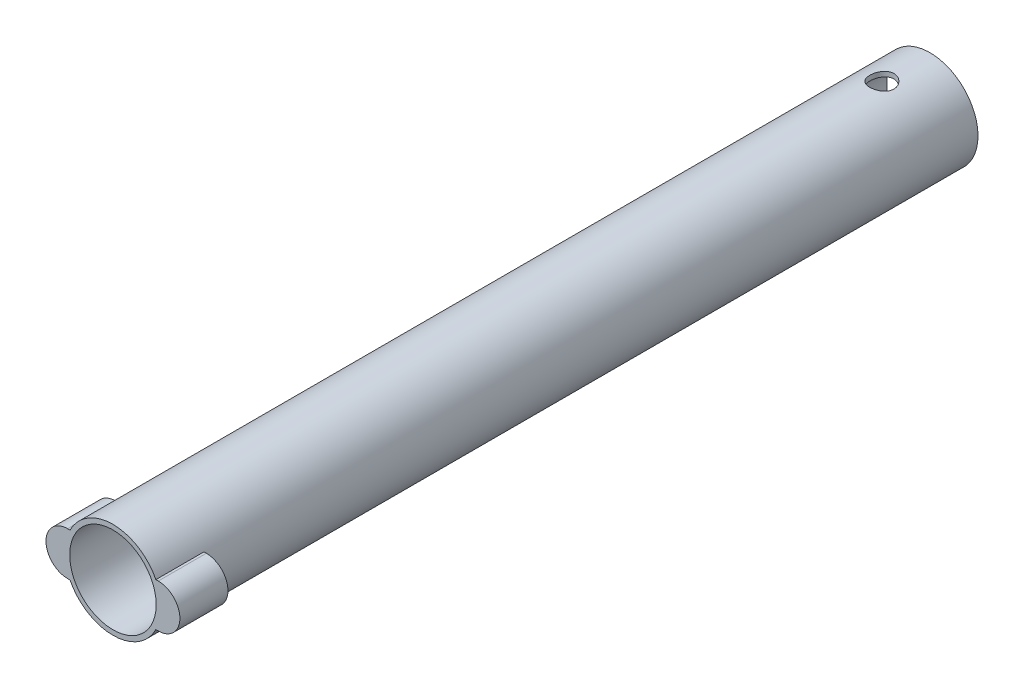
ISO-10303-21;
HEADER;
FILE_DESCRIPTION(('STEP AP214'),'2;1');
FILE_NAME('part.step','',(''),(''),'','','');
FILE_SCHEMA(('AUTOMOTIVE_DESIGN { 1 0 10303 214 1 1 1 1 }'));
ENDSEC;
DATA;
#1=APPLICATION_CONTEXT('core data for automotive mechanical design processes');
#2=APPLICATION_PROTOCOL_DEFINITION('international standard','automotive_design',2000,#1);
#3=PRODUCT_CONTEXT('',#1,'mechanical');
#4=PRODUCT('Part','Part','',(#3));
#5=PRODUCT_RELATED_PRODUCT_CATEGORY('part','',(#4));
#6=PRODUCT_DEFINITION_FORMATION('','',#4);
#7=PRODUCT_DEFINITION_CONTEXT('part definition',#1,'design');
#8=PRODUCT_DEFINITION('design','',#6,#7);
#9=PRODUCT_DEFINITION_SHAPE('','',#8);
#10=(LENGTH_UNIT() NAMED_UNIT(*) SI_UNIT(.MILLI.,.METRE.));
#11=(NAMED_UNIT(*) PLANE_ANGLE_UNIT() SI_UNIT($,.RADIAN.));
#12=(NAMED_UNIT(*) SI_UNIT($,.STERADIAN.) SOLID_ANGLE_UNIT());
#13=UNCERTAINTY_MEASURE_WITH_UNIT(LENGTH_MEASURE(1.E-05),#10,'distance_accuracy_value','');
#14=(GEOMETRIC_REPRESENTATION_CONTEXT(3) GLOBAL_UNCERTAINTY_ASSIGNED_CONTEXT((#13)) GLOBAL_UNIT_ASSIGNED_CONTEXT((#10,
#11,#12)) REPRESENTATION_CONTEXT('',''));
#15=CARTESIAN_POINT('',(0.,0.,0.));
#16=DIRECTION('',(0.,0.,1.));
#17=DIRECTION('',(1.,0.,0.));
#18=AXIS2_PLACEMENT_3D('',#15,#16,#17);
#19=CARTESIAN_POINT('',(0.,0.,170.));
#20=DIRECTION('',(0.,0.,1.));
#21=DIRECTION('',(1.,0.,0.));
#22=AXIS2_PLACEMENT_3D('',#19,#20,#21);
#23=PLANE('',#22);
#24=CARTESIAN_POINT('',(0.,0.,170.));
#25=DIRECTION('',(0.,0.,1.));
#26=DIRECTION('',(1.,0.,0.));
#27=AXIS2_PLACEMENT_3D('',#24,#25,#26);
#28=CIRCLE('',#27,10.);
#29=CARTESIAN_POINT('',(-8.93028554974588,-4.5,170.));
#30=VERTEX_POINT('',#29);
#31=CARTESIAN_POINT('',(8.93028554974583,-4.50000000000008,170.));
#32=VERTEX_POINT('',#31);
#33=EDGE_CURVE('E11',#30,#32,#28,.T.);
#34=ORIENTED_EDGE('',*,*,#33,.T.);
#35=DIRECTION('',(1.,0.,0.));
#36=VECTOR('',#35,1.);
#37=CARTESIAN_POINT('',(8.93028554974583,-4.50000000000008,170.));
#38=LINE('',#37,#36);
#39=CARTESIAN_POINT('',(9.43028554974587,-4.50000000000008,170.));
#40=VERTEX_POINT('',#39);
#41=EDGE_CURVE('E138',#32,#40,#38,.T.);
#42=ORIENTED_EDGE('',*,*,#41,.T.);
#43=CARTESIAN_POINT('',(9.4302855497459,0.,170.));
#44=DIRECTION('',(0.,0.,1.));
#45=DIRECTION('',(-1.,0.,0.));
#46=AXIS2_PLACEMENT_3D('',#43,#44,#45);
#47=CIRCLE('',#46,4.5);
#48=CARTESIAN_POINT('',(9.43028554974592,4.49999999999992,170.));
#49=VERTEX_POINT('',#48);
#50=EDGE_CURVE('E154',#40,#49,#47,.T.);
#51=ORIENTED_EDGE('',*,*,#50,.T.);
#52=DIRECTION('',(-1.,0.,0.));
#53=VECTOR('',#52,1.);
#54=CARTESIAN_POINT('',(8.93028554974592,4.49999999999992,170.));
#55=LINE('',#54,#53);
#56=CARTESIAN_POINT('',(8.93028554974592,4.49999999999992,170.));
#57=VERTEX_POINT('',#56);
#58=EDGE_CURVE('E63',#49,#57,#55,.T.);
#59=ORIENTED_EDGE('',*,*,#58,.T.);
#60=CARTESIAN_POINT('',(-8.93028554974588,4.5,170.));
#61=VERTEX_POINT('',#60);
#62=EDGE_CURVE('E55',#57,#61,#28,.T.);
#63=ORIENTED_EDGE('',*,*,#62,.T.);
#64=DIRECTION('',(-1.,0.,0.));
#65=VECTOR('',#64,1.);
#66=CARTESIAN_POINT('',(-9.43028554974588,4.5,170.));
#67=LINE('',#66,#65);
#68=CARTESIAN_POINT('',(-9.43028554974588,4.5,170.));
#69=VERTEX_POINT('',#68);
#70=EDGE_CURVE('E173',#61,#69,#67,.T.);
#71=ORIENTED_EDGE('',*,*,#70,.T.);
#72=CARTESIAN_POINT('',(-9.4302855497459,0.,170.));
#73=DIRECTION('',(0.,0.,1.));
#74=DIRECTION('',(1.,0.,0.));
#75=AXIS2_PLACEMENT_3D('',#72,#73,#74);
#76=CIRCLE('',#75,4.5);
#77=CARTESIAN_POINT('',(-9.43028554974588,-4.5,170.));
#78=VERTEX_POINT('',#77);
#79=EDGE_CURVE('E161',#69,#78,#76,.T.);
#80=ORIENTED_EDGE('',*,*,#79,.T.);
#81=DIRECTION('',(1.,0.,0.));
#82=VECTOR('',#81,1.);
#83=CARTESIAN_POINT('',(-9.43028554974588,-4.5,170.));
#84=LINE('',#83,#82);
#85=EDGE_CURVE('E69',#78,#30,#84,.T.);
#86=ORIENTED_EDGE('',*,*,#85,.T.);
#87=EDGE_LOOP('',(#34,#42,#51,#59,#63,#71,#80,#86));
#88=FACE_BOUND('',#87,.T.);
#89=CARTESIAN_POINT('',(0.,0.,170.));
#90=DIRECTION('',(0.,0.,1.));
#91=DIRECTION('',(1.,0.,0.));
#92=AXIS2_PLACEMENT_3D('',#89,#90,#91);
#93=CIRCLE('',#92,9.);
#94=CARTESIAN_POINT('',(9.,0.,170.));
#95=VERTEX_POINT('',#94);
#96=EDGE_CURVE('E206',#95,#95,#93,.T.);
#97=ORIENTED_EDGE('',*,*,#96,.F.);
#98=EDGE_LOOP('',(#97));
#99=FACE_BOUND('',#98,.T.);
#100=ADVANCED_FACE('F39',(#88,#99),#23,.T.);
#101=CARTESIAN_POINT('',(0.,0.,0.));
#102=DIRECTION('',(0.,0.,1.));
#103=DIRECTION('',(1.,0.,0.));
#104=AXIS2_PLACEMENT_3D('',#101,#102,#103);
#105=PLANE('',#104);
#106=CARTESIAN_POINT('',(0.,0.,0.));
#107=DIRECTION('',(0.,0.,1.));
#108=DIRECTION('',(1.,0.,0.));
#109=AXIS2_PLACEMENT_3D('',#106,#107,#108);
#110=CIRCLE('',#109,10.);
#111=CARTESIAN_POINT('',(10.,0.,0.));
#112=VERTEX_POINT('',#111);
#113=EDGE_CURVE('E210',#112,#112,#110,.T.);
#114=ORIENTED_EDGE('',*,*,#113,.F.);
#115=EDGE_LOOP('',(#114));
#116=FACE_BOUND('',#115,.T.);
#117=CARTESIAN_POINT('',(0.,0.,0.));
#118=DIRECTION('',(0.,0.,1.));
#119=DIRECTION('',(1.,0.,0.));
#120=AXIS2_PLACEMENT_3D('',#117,#118,#119);
#121=CIRCLE('',#120,9.);
#122=CARTESIAN_POINT('',(9.,0.,0.));
#123=VERTEX_POINT('',#122);
#124=EDGE_CURVE('E196',#123,#123,#121,.T.);
#125=ORIENTED_EDGE('',*,*,#124,.T.);
#126=EDGE_LOOP('',(#125));
#127=FACE_BOUND('',#126,.T.);
#128=ADVANCED_FACE('F260',(#116,#127),#105,.F.);
#129=CARTESIAN_POINT('',(0.,0.,170.));
#130=DIRECTION('',(0.,0.,-1.));
#131=DIRECTION('',(-1.,0.,0.));
#132=AXIS2_PLACEMENT_3D('',#129,#130,#131);
#133=CYLINDRICAL_SURFACE('',#132,10.);
#134=CARTESIAN_POINT('',(0.,-10.,12.5));
#135=CARTESIAN_POINT('',(0.138126814449552,-9.99999766446687,12.4999961237697));
#136=CARTESIAN_POINT('',(0.276296929717939,-9.99710963553044,12.4885140820437));
#137=CARTESIAN_POINT('',(0.548677206284221,-9.98586856383157,12.442958081155));
#138=CARTESIAN_POINT('',(0.6828850781179,-9.97751242366627,12.4088713174369));
#139=CARTESIAN_POINT('',(0.943368120304295,-9.9562604388672,12.3192679108965));
#140=CARTESIAN_POINT('',(1.06965260571667,-9.94337004736764,12.2637770021412));
#141=CARTESIAN_POINT('',(1.31112021984071,-9.91442239679369,12.1330310165919));
#142=CARTESIAN_POINT('',(1.42630297391461,-9.89836503090261,12.0577752731351));
#143=CARTESIAN_POINT('',(1.64466987883486,-9.86445689319489,11.8879986839097));
#144=CARTESIAN_POINT('',(1.74759281676843,-9.84657845246877,11.7931473750682));
#145=CARTESIAN_POINT('',(1.93624821200553,-9.8112270019656,11.5875796584849));
#146=CARTESIAN_POINT('',(2.02197872824865,-9.79375403816446,11.4768614617551));
#147=CARTESIAN_POINT('',(2.17504423799829,-9.76091292830281,11.240674622105));
#148=CARTESIAN_POINT('',(2.2420870265419,-9.74557990774685,11.1150112819855));
#149=CARTESIAN_POINT('',(2.35399484758457,-9.71915824696694,10.8537526472333));
#150=CARTESIAN_POINT('',(2.39886342573357,-9.70806892824031,10.7181589444466));
#151=CARTESIAN_POINT('',(2.46425806134128,-9.69167461160538,10.4437608363306));
#152=CARTESIAN_POINT('',(2.48525378055342,-9.68625818328352,10.30507517327));
#153=CARTESIAN_POINT('',(2.50376962511068,-9.68148937432652,10.0260523850011));
#154=CARTESIAN_POINT('',(2.50129356969685,-9.68213600713214,9.88571553217977));
#155=CARTESIAN_POINT('',(2.47331087439951,-9.68932009194695,9.61097365375774));
#156=CARTESIAN_POINT('',(2.44836390031772,-9.69571438345489,9.47650729755778));
#157=CARTESIAN_POINT('',(2.37704031150499,-9.71344516118448,9.2137315818149));
#158=CARTESIAN_POINT('',(2.33066217011566,-9.72478199948731,9.08542266161846));
#159=CARTESIAN_POINT('',(2.21731579656198,-9.75125189842765,8.83710330624645));
#160=CARTESIAN_POINT('',(2.1501444453882,-9.76642212449693,8.71718971368405));
#161=CARTESIAN_POINT('',(1.99726046002491,-9.79882851409985,8.49013548373863));
#162=CARTESIAN_POINT('',(1.91154458134806,-9.81606503891047,8.38299708655458));
#163=CARTESIAN_POINT('',(1.72110570780203,-9.85126467566485,8.18132730717599));
#164=CARTESIAN_POINT('',(1.61591043027643,-9.86923449130001,8.08724251656441));
#165=CARTESIAN_POINT('',(1.39101986250616,-9.90343275964594,7.91796459589349));
#166=CARTESIAN_POINT('',(1.27132412951324,-9.91966115915679,7.84277204289406));
#167=CARTESIAN_POINT('',(1.02019314780232,-9.94862886823651,7.71324902295935));
#168=CARTESIAN_POINT('',(0.888718988681039,-9.96135600212879,7.65899109957595));
#169=CARTESIAN_POINT('',(0.618126680238138,-9.98179861652361,7.57347115715071));
#170=CARTESIAN_POINT('',(0.479009998584141,-9.98951505565468,7.5422047393031));
#171=CARTESIAN_POINT('',(0.200899950650044,-9.99892498785624,7.50423739073527));
#172=CARTESIAN_POINT('',(0.0619945333136826,-10.0007675584713,7.49692828987449));
#173=CARTESIAN_POINT('',(-0.215054791335848,-9.99864674690754,7.50541500342581));
#174=CARTESIAN_POINT('',(-0.353198766074328,-9.99468388736421,7.52120873799856));
#175=CARTESIAN_POINT('',(-0.622690447960818,-9.98149301878918,7.57495151398563));
#176=CARTESIAN_POINT('',(-0.754108531614583,-9.97234390309647,7.61256877246162));
#177=CARTESIAN_POINT('',(-1.00876215408753,-9.94981177723595,7.7085118067141));
#178=CARTESIAN_POINT('',(-1.13199686505442,-9.93642833949965,7.76683967385537));
#179=CARTESIAN_POINT('',(-1.36920522404972,-9.9065551321037,7.90372688145779));
#180=CARTESIAN_POINT('',(-1.48297573639294,-9.89001445610999,7.98262685399427));
#181=CARTESIAN_POINT('',(-1.69587768940552,-9.85574181979586,8.15798318132861));
#182=CARTESIAN_POINT('',(-1.79500659828875,-9.83800965421578,8.25444256602941));
#183=CARTESIAN_POINT('',(-1.97831761345414,-9.80281594932498,8.46500326807284));
#184=CARTESIAN_POINT('',(-2.06207311270184,-9.78537173637463,8.57947950499927));
#185=CARTESIAN_POINT('',(-2.20918459835605,-9.75321463970069,8.82122105744763));
#186=CARTESIAN_POINT('',(-2.27254149026901,-9.73850163474941,8.94848580495074));
#187=CARTESIAN_POINT('',(-2.37658570101224,-9.71363491194665,9.21150953734373));
#188=CARTESIAN_POINT('',(-2.41740732773931,-9.70345425375809,9.34721271385383));
#189=CARTESIAN_POINT('',(-2.47557609990489,-9.68877906706585,9.62384939642549));
#190=CARTESIAN_POINT('',(-2.49292837912652,-9.68428329504044,9.76478175170242));
#191=CARTESIAN_POINT('',(-2.50339765056083,-9.68158168701612,10.0435350397693));
#192=CARTESIAN_POINT('',(-2.49719649630132,-9.68319887888035,10.1813290585441));
#193=CARTESIAN_POINT('',(-2.46229546385366,-9.69213181672143,10.4538398144438));
#194=CARTESIAN_POINT('',(-2.43359603781098,-9.69944744817731,10.5885566133553));
#195=CARTESIAN_POINT('',(-2.35488553240495,-9.71885434473222,10.8503474317764));
#196=CARTESIAN_POINT('',(-2.30500234113404,-9.73091692061057,10.9774621754006));
#197=CARTESIAN_POINT('',(-2.18544152267504,-9.7584625954084,11.2216089711893));
#198=CARTESIAN_POINT('',(-2.11576115005696,-9.77394616867808,11.3386396219781));
#199=CARTESIAN_POINT('',(-1.95644624772858,-9.80709390439337,11.5625910483368));
#200=CARTESIAN_POINT('',(-1.86633860485376,-9.82480441386302,11.6691684557066));
#201=CARTESIAN_POINT('',(-1.66964895198289,-9.86013378743769,11.8659117413257));
#202=CARTESIAN_POINT('',(-1.56306303543524,-9.87775262878422,11.9560737168549));
#203=CARTESIAN_POINT('',(-1.33411264450432,-9.9112942607945,12.1190188476077));
#204=CARTESIAN_POINT('',(-1.21149737052731,-9.92718055609783,12.1914576894526));
#205=CARTESIAN_POINT('',(-0.95544343251746,-9.95508208291861,12.3145791049009));
#206=CARTESIAN_POINT('',(-0.822012605727899,-9.96710008666301,12.3652772677476));
#207=CARTESIAN_POINT('',(-0.574017088739119,-9.98413432609236,12.4359530505494));
#208=CARTESIAN_POINT('',(-0.460633618180114,-9.99004308421151,12.4599187384224));
#209=CARTESIAN_POINT('',(-0.231510119227139,-9.9979767538658,12.4919432393699));
#210=CARTESIAN_POINT('',(-0.115770268737694,-10.0000019575149,12.5000032488422));
#211=CARTESIAN_POINT('',(0.,-10.,12.5));
#212=B_SPLINE_CURVE_WITH_KNOTS('',3,(#134,#135,#136,#137,#138,#139,#140,#141,#142,#143,#144,
#145,#146,#147,#148,#149,#150,#151,#152,#153,#154,#155,#156,#157,#158,#159,#160,#161,#162,#163,
#164,#165,#166,#167,#168,#169,#170,#171,#172,#173,#174,#175,#176,#177,#178,#179,#180,#181,#182,
#183,#184,#185,#186,#187,#188,#189,#190,#191,#192,#193,#194,#195,#196,#197,#198,#199,#200,#201,
#202,#203,#204,#205,#206,#207,#208,#209,#210,#211),.UNSPECIFIED.,.T.,.F.,(4,2,2,2,2,2,2,2,2,2,2,
2,2,2,2,2,2,2,2,2,2,2,2,2,2,2,2,2,2,2,2,2,2,2,2,2,2,2,4),(0.,0.41395618745315,0.828147062939833,
1.24184150381018,1.65554990028221,2.07690725728565,2.4983121596677,2.92597745909678,
3.35357435282281,3.77260491835116,4.19156730193363,4.60037495017231,5.00921172448932,
5.42217546462,5.83521151399139,6.26002501620567,6.6848514926928,7.11113715020725,
7.5373412281994,7.95263848254329,8.36789835193439,8.7770045752893,9.18615212209352,
9.60255979281122,10.0190393835223,10.44574182013,10.8724253125472,11.2965375769764,
11.7205570543048,12.1323963400749,12.5442273493652,12.9536066760888,13.3630428023797,
13.7831596069298,14.2033761629383,14.6312030917578,15.0587227304538,15.4057040491338,
15.752659267482),.UNSPECIFIED.);
#213=CARTESIAN_POINT('',(0.,-10.,12.5));
#214=VERTEX_POINT('',#213);
#215=EDGE_CURVE('E144',#214,#214,#212,.T.);
#216=ORIENTED_EDGE('',*,*,#215,.T.);
#217=EDGE_LOOP('',(#216));
#218=FACE_BOUND('',#217,.T.);
#219=CARTESIAN_POINT('',(0.,10.,12.5));
#220=CARTESIAN_POINT('',(-0.138126814449552,9.99999766446687,12.4999961237697));
#221=CARTESIAN_POINT('',(-0.276296929717939,9.99710963553044,12.4885140820437));
#222=CARTESIAN_POINT('',(-0.548677206284221,9.98586856383157,12.442958081155));
#223=CARTESIAN_POINT('',(-0.6828850781179,9.97751242366627,12.4088713174369));
#224=CARTESIAN_POINT('',(-0.943368120304295,9.9562604388672,12.3192679108965));
#225=CARTESIAN_POINT('',(-1.06965260571667,9.94337004736764,12.2637770021412));
#226=CARTESIAN_POINT('',(-1.31112021984071,9.91442239679369,12.1330310165919));
#227=CARTESIAN_POINT('',(-1.42630297391461,9.89836503090261,12.0577752731351));
#228=CARTESIAN_POINT('',(-1.64466987883486,9.86445689319489,11.8879986839097));
#229=CARTESIAN_POINT('',(-1.74759281676843,9.84657845246877,11.7931473750682));
#230=CARTESIAN_POINT('',(-1.93624821200553,9.8112270019656,11.5875796584849));
#231=CARTESIAN_POINT('',(-2.02197872824865,9.79375403816446,11.4768614617551));
#232=CARTESIAN_POINT('',(-2.17504423799829,9.76091292830281,11.240674622105));
#233=CARTESIAN_POINT('',(-2.2420870265419,9.74557990774685,11.1150112819855));
#234=CARTESIAN_POINT('',(-2.35399484758457,9.71915824696694,10.8537526472333));
#235=CARTESIAN_POINT('',(-2.39886342573357,9.70806892824031,10.7181589444466));
#236=CARTESIAN_POINT('',(-2.46425806134128,9.69167461160538,10.4437608363306));
#237=CARTESIAN_POINT('',(-2.48525378055342,9.68625818328352,10.30507517327));
#238=CARTESIAN_POINT('',(-2.50376962511068,9.68148937432652,10.0260523850011));
#239=CARTESIAN_POINT('',(-2.50129356969685,9.68213600713214,9.88571553217977));
#240=CARTESIAN_POINT('',(-2.47331087439951,9.68932009194695,9.61097365375774));
#241=CARTESIAN_POINT('',(-2.44836390031772,9.69571438345489,9.47650729755778));
#242=CARTESIAN_POINT('',(-2.37704031150499,9.71344516118448,9.2137315818149));
#243=CARTESIAN_POINT('',(-2.33066217011566,9.72478199948731,9.08542266161846));
#244=CARTESIAN_POINT('',(-2.21731579656198,9.75125189842765,8.83710330624645));
#245=CARTESIAN_POINT('',(-2.1501444453882,9.76642212449693,8.71718971368405));
#246=CARTESIAN_POINT('',(-1.99726046002491,9.79882851409985,8.49013548373863));
#247=CARTESIAN_POINT('',(-1.91154458134806,9.81606503891047,8.38299708655458));
#248=CARTESIAN_POINT('',(-1.72110570780203,9.85126467566485,8.18132730717599));
#249=CARTESIAN_POINT('',(-1.61591043027643,9.86923449130001,8.08724251656441));
#250=CARTESIAN_POINT('',(-1.39101986250616,9.90343275964594,7.91796459589349));
#251=CARTESIAN_POINT('',(-1.27132412951324,9.91966115915679,7.84277204289406));
#252=CARTESIAN_POINT('',(-1.02019314780232,9.94862886823651,7.71324902295935));
#253=CARTESIAN_POINT('',(-0.888718988681039,9.96135600212879,7.65899109957595));
#254=CARTESIAN_POINT('',(-0.618126680238138,9.98179861652361,7.57347115715071));
#255=CARTESIAN_POINT('',(-0.479009998584141,9.98951505565468,7.5422047393031));
#256=CARTESIAN_POINT('',(-0.200899950650044,9.99892498785624,7.50423739073527));
#257=CARTESIAN_POINT('',(-0.0619945333136826,10.0007675584713,7.49692828987449));
#258=CARTESIAN_POINT('',(0.215054791335848,9.99864674690754,7.50541500342581));
#259=CARTESIAN_POINT('',(0.353198766074328,9.99468388736421,7.52120873799856));
#260=CARTESIAN_POINT('',(0.622690447960818,9.98149301878918,7.57495151398563));
#261=CARTESIAN_POINT('',(0.754108531614583,9.97234390309647,7.61256877246162));
#262=CARTESIAN_POINT('',(1.00876215408753,9.94981177723595,7.7085118067141));
#263=CARTESIAN_POINT('',(1.13199686505442,9.93642833949965,7.76683967385537));
#264=CARTESIAN_POINT('',(1.36920522404972,9.9065551321037,7.90372688145779));
#265=CARTESIAN_POINT('',(1.48297573639294,9.89001445610999,7.98262685399427));
#266=CARTESIAN_POINT('',(1.69587768940552,9.85574181979586,8.15798318132861));
#267=CARTESIAN_POINT('',(1.79500659828875,9.83800965421578,8.25444256602941));
#268=CARTESIAN_POINT('',(1.97831761345414,9.80281594932498,8.46500326807284));
#269=CARTESIAN_POINT('',(2.06207311270184,9.78537173637463,8.57947950499927));
#270=CARTESIAN_POINT('',(2.20918459835605,9.75321463970069,8.82122105744763));
#271=CARTESIAN_POINT('',(2.27254149026901,9.73850163474941,8.94848580495074));
#272=CARTESIAN_POINT('',(2.37658570101224,9.71363491194665,9.21150953734373));
#273=CARTESIAN_POINT('',(2.41740732773931,9.70345425375809,9.34721271385383));
#274=CARTESIAN_POINT('',(2.47557609990489,9.68877906706585,9.62384939642549));
#275=CARTESIAN_POINT('',(2.49292837912652,9.68428329504044,9.76478175170242));
#276=CARTESIAN_POINT('',(2.50339765056083,9.68158168701612,10.0435350397693));
#277=CARTESIAN_POINT('',(2.49719649630132,9.68319887888035,10.1813290585441));
#278=CARTESIAN_POINT('',(2.46229546385366,9.69213181672143,10.4538398144438));
#279=CARTESIAN_POINT('',(2.43359603781098,9.69944744817731,10.5885566133553));
#280=CARTESIAN_POINT('',(2.35488553240495,9.71885434473222,10.8503474317764));
#281=CARTESIAN_POINT('',(2.30500234113404,9.73091692061057,10.9774621754006));
#282=CARTESIAN_POINT('',(2.18544152267504,9.7584625954084,11.2216089711893));
#283=CARTESIAN_POINT('',(2.11576115005696,9.77394616867808,11.3386396219781));
#284=CARTESIAN_POINT('',(1.95644624772858,9.80709390439337,11.5625910483368));
#285=CARTESIAN_POINT('',(1.86633860485376,9.82480441386302,11.6691684557066));
#286=CARTESIAN_POINT('',(1.66964895198289,9.86013378743769,11.8659117413257));
#287=CARTESIAN_POINT('',(1.56306303543524,9.87775262878422,11.9560737168549));
#288=CARTESIAN_POINT('',(1.33411264450432,9.9112942607945,12.1190188476077));
#289=CARTESIAN_POINT('',(1.21149737052731,9.92718055609783,12.1914576894526));
#290=CARTESIAN_POINT('',(0.95544343251746,9.95508208291861,12.3145791049009));
#291=CARTESIAN_POINT('',(0.822012605727899,9.96710008666301,12.3652772677476));
#292=CARTESIAN_POINT('',(0.574017088739119,9.98413432609236,12.4359530505494));
#293=CARTESIAN_POINT('',(0.460633618180114,9.99004308421151,12.4599187384224));
#294=CARTESIAN_POINT('',(0.231510119227139,9.9979767538658,12.4919432393699));
#295=CARTESIAN_POINT('',(0.115770268737694,10.0000019575149,12.5000032488422));
#296=CARTESIAN_POINT('',(0.,10.,12.5));
#297=B_SPLINE_CURVE_WITH_KNOTS('',3,(#219,#220,#221,#222,#223,#224,#225,#226,#227,#228,#229,
#230,#231,#232,#233,#234,#235,#236,#237,#238,#239,#240,#241,#242,#243,#244,#245,#246,#247,#248,
#249,#250,#251,#252,#253,#254,#255,#256,#257,#258,#259,#260,#261,#262,#263,#264,#265,#266,#267,
#268,#269,#270,#271,#272,#273,#274,#275,#276,#277,#278,#279,#280,#281,#282,#283,#284,#285,#286,
#287,#288,#289,#290,#291,#292,#293,#294,#295,#296),.UNSPECIFIED.,.T.,.F.,(4,2,2,2,2,2,2,2,2,2,2,
2,2,2,2,2,2,2,2,2,2,2,2,2,2,2,2,2,2,2,2,2,2,2,2,2,2,2,4),(0.,0.41395618745315,0.828147062939833,
1.24184150381018,1.65554990028221,2.07690725728565,2.4983121596677,2.92597745909678,
3.35357435282281,3.77260491835116,4.19156730193363,4.60037495017231,5.00921172448932,
5.42217546462,5.83521151399139,6.26002501620567,6.6848514926928,7.11113715020725,
7.5373412281994,7.95263848254329,8.36789835193439,8.7770045752893,9.18615212209352,
9.60255979281122,10.0190393835223,10.44574182013,10.8724253125472,11.2965375769764,
11.7205570543048,12.1323963400749,12.5442273493652,12.9536066760888,13.3630428023797,
13.7831596069298,14.2033761629383,14.6312030917578,15.0587227304538,15.4057040491338,
15.752659267482),.UNSPECIFIED.);
#298=CARTESIAN_POINT('',(0.,10.,12.5));
#299=VERTEX_POINT('',#298);
#300=EDGE_CURVE('E236',#299,#299,#297,.T.);
#301=ORIENTED_EDGE('',*,*,#300,.T.);
#302=EDGE_LOOP('',(#301));
#303=FACE_BOUND('',#302,.T.);
#304=CARTESIAN_POINT('',(0.,0.,160.));
#305=DIRECTION('',(0.,0.,-1.));
#306=DIRECTION('',(1.,0.,0.));
#307=AXIS2_PLACEMENT_3D('',#304,#305,#306);
#308=CIRCLE('',#307,10.);
#309=CARTESIAN_POINT('',(8.93028554974592,4.49999999999992,160.));
#310=VERTEX_POINT('',#309);
#311=CARTESIAN_POINT('',(8.93028554974583,-4.50000000000008,160.));
#312=VERTEX_POINT('',#311);
#313=EDGE_CURVE('E132',#310,#312,#308,.T.);
#314=ORIENTED_EDGE('',*,*,#313,.T.);
#315=DIRECTION('',(0.,0.,1.));
#316=VECTOR('',#315,1.);
#317=CARTESIAN_POINT('',(8.93028554974583,-4.50000000000008,160.));
#318=LINE('',#317,#316);
#319=EDGE_CURVE('E162',#312,#32,#318,.T.);
#320=ORIENTED_EDGE('',*,*,#319,.T.);
#321=ORIENTED_EDGE('',*,*,#33,.F.);
#322=DIRECTION('',(0.,0.,1.));
#323=VECTOR('',#322,1.);
#324=CARTESIAN_POINT('',(-8.93028554974588,-4.5,160.));
#325=LINE('',#324,#323);
#326=CARTESIAN_POINT('',(-8.93028554974588,-4.5,160.));
#327=VERTEX_POINT('',#326);
#328=EDGE_CURVE('E201',#327,#30,#325,.T.);
#329=ORIENTED_EDGE('',*,*,#328,.F.);
#330=CARTESIAN_POINT('',(0.,0.,160.));
#331=DIRECTION('',(0.,0.,-1.));
#332=DIRECTION('',(1.,0.,0.));
#333=AXIS2_PLACEMENT_3D('',#330,#331,#332);
#334=CIRCLE('',#333,10.);
#335=CARTESIAN_POINT('',(-8.93028554974588,4.5,160.));
#336=VERTEX_POINT('',#335);
#337=EDGE_CURVE('E177',#327,#336,#334,.T.);
#338=ORIENTED_EDGE('',*,*,#337,.T.);
#339=DIRECTION('',(0.,0.,1.));
#340=VECTOR('',#339,1.);
#341=CARTESIAN_POINT('',(-8.93028554974588,4.5,160.));
#342=LINE('',#341,#340);
#343=EDGE_CURVE('E197',#336,#61,#342,.T.);
#344=ORIENTED_EDGE('',*,*,#343,.T.);
#345=ORIENTED_EDGE('',*,*,#62,.F.);
#346=DIRECTION('',(0.,0.,1.));
#347=VECTOR('',#346,1.);
#348=CARTESIAN_POINT('',(8.93028554974592,4.49999999999992,160.));
#349=LINE('',#348,#347);
#350=EDGE_CURVE('E122',#310,#57,#349,.T.);
#351=ORIENTED_EDGE('',*,*,#350,.F.);
#352=EDGE_LOOP('',(#314,#320,#321,#329,#338,#344,#345,#351));
#353=FACE_BOUND('',#352,.T.);
#354=ORIENTED_EDGE('',*,*,#113,.T.);
#355=EDGE_LOOP('',(#354));
#356=FACE_BOUND('',#355,.T.);
#357=ADVANCED_FACE('F41',(#218,#303,#353,#356),#133,.T.);
#358=CARTESIAN_POINT('',(0.,0.,170.));
#359=DIRECTION('',(0.,0.,-1.));
#360=DIRECTION('',(-1.,0.,0.));
#361=AXIS2_PLACEMENT_3D('',#358,#359,#360);
#362=CYLINDRICAL_SURFACE('',#361,9.);
#363=CARTESIAN_POINT('',(0.,-9.,12.5));
#364=CARTESIAN_POINT('',(0.137602501766358,-8.99999816033858,12.4999972008295));
#365=CARTESIAN_POINT('',(0.275234247505334,-8.99681348173661,12.4886013603894));
#366=CARTESIAN_POINT('',(0.546518951988477,-8.98441900396477,12.4434085434694));
#367=CARTESIAN_POINT('',(0.680170207326879,-8.97520666298524,12.4096021165726));
#368=CARTESIAN_POINT('',(0.939539899360603,-8.95177130789171,12.3207825611722));
#369=CARTESIAN_POINT('',(1.06526878019134,-8.9375550606186,12.2657980626032));
#370=CARTESIAN_POINT('',(1.30572139048355,-8.90560625164058,12.1362929873462));
#371=CARTESIAN_POINT('',(1.42044414162461,-8.88787337777625,12.0617706761614));
#372=CARTESIAN_POINT('',(1.63849356943184,-8.85030315634725,11.8933411323144));
#373=CARTESIAN_POINT('',(1.74150622561691,-8.8304274724643,11.7990359206252));
#374=CARTESIAN_POINT('',(1.93047637139272,-8.79105214235473,11.5945674457565));
#375=CARTESIAN_POINT('',(2.01643146169124,-8.77155254937625,11.4844019554483));
#376=CARTESIAN_POINT('',(2.17041617160631,-8.73474088585436,11.2487854797426));
#377=CARTESIAN_POINT('',(2.23807749895613,-8.71747695878199,11.1230855831171));
#378=CARTESIAN_POINT('',(2.35117914262341,-8.68765801630374,10.8615361647152));
#379=CARTESIAN_POINT('',(2.39662394672714,-8.67510204999899,10.7256886991666));
#380=CARTESIAN_POINT('',(2.46289848736025,-8.65651766235508,10.4511944222944));
#381=CARTESIAN_POINT('',(2.48430073808207,-8.65033771821211,10.3126963567531));
#382=CARTESIAN_POINT('',(2.50366854155516,-8.644752985852,10.0339482289146));
#383=CARTESIAN_POINT('',(2.50163888054626,-8.64534681401298,9.89369853025512));
#384=CARTESIAN_POINT('',(2.4746534267536,-8.65310733650123,9.61995544255189));
#385=CARTESIAN_POINT('',(2.45039804541374,-8.66007321349828,9.48638639700685));
#386=CARTESIAN_POINT('',(2.38077462403778,-8.67947034094293,9.22529274281753));
#387=CARTESIAN_POINT('',(2.33540476914307,-8.6919020611927,9.09776865479569));
#388=CARTESIAN_POINT('',(2.22428746268939,-8.72100139554956,8.85059553708924));
#389=CARTESIAN_POINT('',(2.15830043673985,-8.7377183720132,8.73106026637984));
#390=CARTESIAN_POINT('',(2.00798881359269,-8.77347901367673,8.50451684881757));
#391=CARTESIAN_POINT('',(1.9236603325812,-8.79252317128379,8.39751136254774));
#392=CARTESIAN_POINT('',(1.73551122056889,-8.83162144253916,8.19507223912715));
#393=CARTESIAN_POINT('',(1.63110455940472,-8.85168740075652,8.10018473024029));
#394=CARTESIAN_POINT('',(1.40761321440207,-8.88996399621587,7.92914853844438));
#395=CARTESIAN_POINT('',(1.28852785084393,-8.90817454746904,7.85300072379504));
#396=CARTESIAN_POINT('',(1.03816685867623,-8.94081679425529,7.72133636873985));
#397=CARTESIAN_POINT('',(0.906832791495496,-8.95522897291068,7.66592579212219));
#398=CARTESIAN_POINT('',(0.63621997753943,-8.97850985002887,7.57813180311726));
#399=CARTESIAN_POINT('',(0.49694312824226,-8.98737986647399,7.54574291568686));
#400=CARTESIAN_POINT('',(0.219053215426284,-8.99837472966817,7.50578572644205));
#401=CARTESIAN_POINT('',(0.080554611717363,-9.00070107648057,7.49747571018566));
#402=CARTESIAN_POINT('',(-0.195859861273136,-8.99892960586322,7.50385399658486));
#403=CARTESIAN_POINT('',(-0.33377579456904,-8.9948325135635,7.51853970329611));
#404=CARTESIAN_POINT('',(-0.602413826941718,-8.98080530118042,7.56988666823926));
#405=CARTESIAN_POINT('',(-0.733222576327722,-8.97098674335107,7.606127890115));
#406=CARTESIAN_POINT('',(-0.986886236237455,-8.94663658338763,7.69906373527622));
#407=CARTESIAN_POINT('',(-1.10974024794481,-8.93210444977129,7.75576066513915));
#408=CARTESIAN_POINT('',(-1.34684028081078,-8.89947480568143,7.88933175609286));
#409=CARTESIAN_POINT('',(-1.4608541239069,-8.88130942680351,7.96660104864484));
#410=CARTESIAN_POINT('',(-1.67455534117418,-8.84350954257204,8.13863227161542));
#411=CARTESIAN_POINT('',(-1.77423962926343,-8.82387472213289,8.23339796013338));
#412=CARTESIAN_POINT('',(-1.95962405388921,-8.78459685365757,8.44120288775478));
#413=CARTESIAN_POINT('',(-2.04479915770501,-8.76497216404559,8.55471490310788));
#414=CARTESIAN_POINT('',(-2.19491162858281,-8.72859386619894,8.79484127576672));
#415=CARTESIAN_POINT('',(-2.25984976965914,-8.71184014816765,8.92145513171229));
#416=CARTESIAN_POINT('',(-2.36716211667702,-8.68329597870045,9.18361433974861));
#417=CARTESIAN_POINT('',(-2.40966154966511,-8.67147806034821,9.31910527542808));
#418=CARTESIAN_POINT('',(-2.47115304987673,-8.65415753646738,9.59569941874383));
#419=CARTESIAN_POINT('',(-2.49015175812551,-8.64865314684267,9.73680102923152));
#420=CARTESIAN_POINT('',(-2.5036971994921,-8.64474076665062,10.0152115590136));
#421=CARTESIAN_POINT('',(-2.49909142028599,-8.64608680814104,10.1524763800691));
#422=CARTESIAN_POINT('',(-2.4675428657362,-8.65514273976249,10.4241897876208));
#423=CARTESIAN_POINT('',(-2.4406007609873,-8.66285243883988,10.5586384585411));
#424=CARTESIAN_POINT('',(-2.36565448497557,-8.68361437649823,10.8197344678233));
#425=CARTESIAN_POINT('',(-2.31784429282323,-8.69661733835621,10.9464416852921));
#426=CARTESIAN_POINT('',(-2.20266903341381,-8.72649832095034,11.1901348450181));
#427=CARTESIAN_POINT('',(-2.13530066717352,-8.74337699532342,11.3071191429723));
#428=CARTESIAN_POINT('',(-1.98041392404219,-8.77977621573303,11.5320553056494));
#429=CARTESIAN_POINT('',(-1.8923241686926,-8.79936357965206,11.6396029533652));
#430=CARTESIAN_POINT('',(-1.69956305490126,-8.83861663818042,11.8386647441072));
#431=CARTESIAN_POINT('',(-1.59488759125637,-8.85828235100436,11.930174905782));
#432=CARTESIAN_POINT('',(-1.36892046461578,-8.89603679163285,12.0967162731561));
#433=CARTESIAN_POINT('',(-1.24729251786436,-8.91407682385634,12.1713032466213));
#434=CARTESIAN_POINT('',(-0.992723965385679,-8.94599949801159,12.298856278579));
#435=CARTESIAN_POINT('',(-0.859790060353449,-8.95988458070658,12.351835037162));
#436=CARTESIAN_POINT('',(-0.606290967533401,-8.98032149663911,12.4284401614694));
#437=CARTESIAN_POINT('',(-0.486728804337482,-8.98764491323713,12.4552095751857));
#438=CARTESIAN_POINT('',(-0.244785251386818,-8.99748469952567,12.4909896916451));
#439=CARTESIAN_POINT('',(-0.12240419603883,-9.00000163646935,12.5000024899999));
#440=CARTESIAN_POINT('',(0.,-9.,12.5));
#441=B_SPLINE_CURVE_WITH_KNOTS('',3,(#363,#364,#365,#366,#367,#368,#369,#370,#371,#372,#373,
#374,#375,#376,#377,#378,#379,#380,#381,#382,#383,#384,#385,#386,#387,#388,#389,#390,#391,#392,
#393,#394,#395,#396,#397,#398,#399,#400,#401,#402,#403,#404,#405,#406,#407,#408,#409,#410,#411,
#412,#413,#414,#415,#416,#417,#418,#419,#420,#421,#422,#423,#424,#425,#426,#427,#428,#429,#430,
#431,#432,#433,#434,#435,#436,#437,#438,#439,#440),.UNSPECIFIED.,.T.,.F.,(4,2,2,2,2,2,2,2,2,2,2,
2,2,2,2,2,2,2,2,2,2,2,2,2,2,2,2,2,2,2,2,2,2,2,2,2,2,2,4),(0.,0.412358386198981,
0.824890772294522,1.23686741588571,1.64888064567586,2.07015248650528,2.49148354087991,
2.92075380647344,3.34993732266769,3.76866863882698,4.18731442577046,4.593204659896,
4.99912978807063,5.40995920090068,5.82087569194107,6.2463898768508,6.67192377325049,
7.09960331280656,7.52718110708771,7.9414402118561,8.35565255505712,8.7620463496373,
9.16848598334834,9.5833789777721,9.99836119210685,10.4261198341446,10.8538621134516,
11.279191297197,11.7044002604958,12.114451985064,12.5244913992549,12.9307978713245,
13.3371729171666,13.7564382656794,14.1758075510164,14.6051618118986,15.0342633576384,
15.4011197307046,15.7679328052827),.UNSPECIFIED.);
#442=CARTESIAN_POINT('',(0.,-9.,12.5));
#443=VERTEX_POINT('',#442);
#444=EDGE_CURVE('E44',#443,#443,#441,.T.);
#445=ORIENTED_EDGE('',*,*,#444,.F.);
#446=EDGE_LOOP('',(#445));
#447=FACE_BOUND('',#446,.T.);
#448=CARTESIAN_POINT('',(0.,9.,12.5));
#449=CARTESIAN_POINT('',(-0.137602501766358,8.99999816033858,12.4999972008295));
#450=CARTESIAN_POINT('',(-0.275234247505334,8.99681348173661,12.4886013603894));
#451=CARTESIAN_POINT('',(-0.546518951988477,8.98441900396477,12.4434085434694));
#452=CARTESIAN_POINT('',(-0.680170207326879,8.97520666298524,12.4096021165726));
#453=CARTESIAN_POINT('',(-0.939539899360603,8.95177130789171,12.3207825611722));
#454=CARTESIAN_POINT('',(-1.06526878019134,8.9375550606186,12.2657980626032));
#455=CARTESIAN_POINT('',(-1.30572139048355,8.90560625164058,12.1362929873462));
#456=CARTESIAN_POINT('',(-1.42044414162461,8.88787337777625,12.0617706761614));
#457=CARTESIAN_POINT('',(-1.63849356943184,8.85030315634725,11.8933411323144));
#458=CARTESIAN_POINT('',(-1.74150622561691,8.8304274724643,11.7990359206252));
#459=CARTESIAN_POINT('',(-1.93047637139272,8.79105214235473,11.5945674457565));
#460=CARTESIAN_POINT('',(-2.01643146169124,8.77155254937625,11.4844019554483));
#461=CARTESIAN_POINT('',(-2.17041617160631,8.73474088585436,11.2487854797426));
#462=CARTESIAN_POINT('',(-2.23807749895613,8.71747695878199,11.1230855831171));
#463=CARTESIAN_POINT('',(-2.35117914262341,8.68765801630374,10.8615361647152));
#464=CARTESIAN_POINT('',(-2.39662394672714,8.67510204999899,10.7256886991666));
#465=CARTESIAN_POINT('',(-2.46289848736025,8.65651766235508,10.4511944222944));
#466=CARTESIAN_POINT('',(-2.48430073808207,8.65033771821211,10.3126963567531));
#467=CARTESIAN_POINT('',(-2.50366854155516,8.644752985852,10.0339482289146));
#468=CARTESIAN_POINT('',(-2.50163888054626,8.64534681401298,9.89369853025512));
#469=CARTESIAN_POINT('',(-2.4746534267536,8.65310733650123,9.61995544255189));
#470=CARTESIAN_POINT('',(-2.45039804541374,8.66007321349828,9.48638639700685));
#471=CARTESIAN_POINT('',(-2.38077462403778,8.67947034094293,9.22529274281753));
#472=CARTESIAN_POINT('',(-2.33540476914307,8.6919020611927,9.09776865479569));
#473=CARTESIAN_POINT('',(-2.22428746268939,8.72100139554956,8.85059553708924));
#474=CARTESIAN_POINT('',(-2.15830043673985,8.7377183720132,8.73106026637984));
#475=CARTESIAN_POINT('',(-2.00798881359269,8.77347901367673,8.50451684881757));
#476=CARTESIAN_POINT('',(-1.9236603325812,8.79252317128379,8.39751136254774));
#477=CARTESIAN_POINT('',(-1.73551122056889,8.83162144253916,8.19507223912715));
#478=CARTESIAN_POINT('',(-1.63110455940472,8.85168740075652,8.10018473024029));
#479=CARTESIAN_POINT('',(-1.40761321440207,8.88996399621587,7.92914853844438));
#480=CARTESIAN_POINT('',(-1.28852785084393,8.90817454746904,7.85300072379504));
#481=CARTESIAN_POINT('',(-1.03816685867623,8.94081679425529,7.72133636873985));
#482=CARTESIAN_POINT('',(-0.906832791495496,8.95522897291068,7.66592579212219));
#483=CARTESIAN_POINT('',(-0.63621997753943,8.97850985002887,7.57813180311726));
#484=CARTESIAN_POINT('',(-0.49694312824226,8.98737986647399,7.54574291568686));
#485=CARTESIAN_POINT('',(-0.219053215426284,8.99837472966817,7.50578572644205));
#486=CARTESIAN_POINT('',(-0.080554611717363,9.00070107648057,7.49747571018566));
#487=CARTESIAN_POINT('',(0.195859861273136,8.99892960586322,7.50385399658486));
#488=CARTESIAN_POINT('',(0.33377579456904,8.9948325135635,7.51853970329611));
#489=CARTESIAN_POINT('',(0.602413826941718,8.98080530118042,7.56988666823926));
#490=CARTESIAN_POINT('',(0.733222576327722,8.97098674335107,7.606127890115));
#491=CARTESIAN_POINT('',(0.986886236237455,8.94663658338763,7.69906373527622));
#492=CARTESIAN_POINT('',(1.10974024794481,8.93210444977129,7.75576066513915));
#493=CARTESIAN_POINT('',(1.34684028081078,8.89947480568143,7.88933175609286));
#494=CARTESIAN_POINT('',(1.4608541239069,8.88130942680351,7.96660104864484));
#495=CARTESIAN_POINT('',(1.67455534117418,8.84350954257204,8.13863227161542));
#496=CARTESIAN_POINT('',(1.77423962926343,8.82387472213289,8.23339796013338));
#497=CARTESIAN_POINT('',(1.95962405388921,8.78459685365757,8.44120288775478));
#498=CARTESIAN_POINT('',(2.04479915770501,8.76497216404559,8.55471490310788));
#499=CARTESIAN_POINT('',(2.19491162858281,8.72859386619894,8.79484127576672));
#500=CARTESIAN_POINT('',(2.25984976965914,8.71184014816765,8.92145513171229));
#501=CARTESIAN_POINT('',(2.36716211667702,8.68329597870045,9.18361433974861));
#502=CARTESIAN_POINT('',(2.40966154966511,8.67147806034821,9.31910527542808));
#503=CARTESIAN_POINT('',(2.47115304987673,8.65415753646738,9.59569941874383));
#504=CARTESIAN_POINT('',(2.49015175812551,8.64865314684267,9.73680102923152));
#505=CARTESIAN_POINT('',(2.5036971994921,8.64474076665062,10.0152115590136));
#506=CARTESIAN_POINT('',(2.49909142028599,8.64608680814104,10.1524763800691));
#507=CARTESIAN_POINT('',(2.4675428657362,8.65514273976249,10.4241897876208));
#508=CARTESIAN_POINT('',(2.4406007609873,8.66285243883988,10.5586384585411));
#509=CARTESIAN_POINT('',(2.36565448497557,8.68361437649823,10.8197344678233));
#510=CARTESIAN_POINT('',(2.31784429282323,8.69661733835621,10.9464416852921));
#511=CARTESIAN_POINT('',(2.20266903341381,8.72649832095034,11.1901348450181));
#512=CARTESIAN_POINT('',(2.13530066717352,8.74337699532342,11.3071191429723));
#513=CARTESIAN_POINT('',(1.98041392404219,8.77977621573303,11.5320553056494));
#514=CARTESIAN_POINT('',(1.8923241686926,8.79936357965206,11.6396029533652));
#515=CARTESIAN_POINT('',(1.69956305490126,8.83861663818042,11.8386647441072));
#516=CARTESIAN_POINT('',(1.59488759125637,8.85828235100436,11.930174905782));
#517=CARTESIAN_POINT('',(1.36892046461578,8.89603679163285,12.0967162731561));
#518=CARTESIAN_POINT('',(1.24729251786436,8.91407682385634,12.1713032466213));
#519=CARTESIAN_POINT('',(0.992723965385679,8.94599949801159,12.298856278579));
#520=CARTESIAN_POINT('',(0.859790060353449,8.95988458070658,12.351835037162));
#521=CARTESIAN_POINT('',(0.606290967533401,8.98032149663911,12.4284401614694));
#522=CARTESIAN_POINT('',(0.486728804337482,8.98764491323713,12.4552095751857));
#523=CARTESIAN_POINT('',(0.244785251386818,8.99748469952567,12.4909896916451));
#524=CARTESIAN_POINT('',(0.12240419603883,9.00000163646935,12.5000024899999));
#525=CARTESIAN_POINT('',(0.,9.,12.5));
#526=B_SPLINE_CURVE_WITH_KNOTS('',3,(#448,#449,#450,#451,#452,#453,#454,#455,#456,#457,#458,
#459,#460,#461,#462,#463,#464,#465,#466,#467,#468,#469,#470,#471,#472,#473,#474,#475,#476,#477,
#478,#479,#480,#481,#482,#483,#484,#485,#486,#487,#488,#489,#490,#491,#492,#493,#494,#495,#496,
#497,#498,#499,#500,#501,#502,#503,#504,#505,#506,#507,#508,#509,#510,#511,#512,#513,#514,#515,
#516,#517,#518,#519,#520,#521,#522,#523,#524,#525),.UNSPECIFIED.,.T.,.F.,(4,2,2,2,2,2,2,2,2,2,2,
2,2,2,2,2,2,2,2,2,2,2,2,2,2,2,2,2,2,2,2,2,2,2,2,2,2,2,4),(0.,0.412358386198981,
0.824890772294522,1.23686741588571,1.64888064567586,2.07015248650528,2.49148354087991,
2.92075380647344,3.34993732266769,3.76866863882698,4.18731442577046,4.593204659896,
4.99912978807063,5.40995920090068,5.82087569194107,6.2463898768508,6.67192377325049,
7.09960331280656,7.52718110708771,7.9414402118561,8.35565255505712,8.7620463496373,
9.16848598334834,9.5833789777721,9.99836119210685,10.4261198341446,10.8538621134516,
11.279191297197,11.7044002604958,12.114451985064,12.5244913992549,12.9307978713245,
13.3371729171666,13.7564382656794,14.1758075510164,14.6051618118986,15.0342633576384,
15.4011197307046,15.7679328052827),.UNSPECIFIED.);
#527=CARTESIAN_POINT('',(0.,9.,12.5));
#528=VERTEX_POINT('',#527);
#529=EDGE_CURVE('E216',#528,#528,#526,.T.);
#530=ORIENTED_EDGE('',*,*,#529,.F.);
#531=EDGE_LOOP('',(#530));
#532=FACE_BOUND('',#531,.T.);
#533=ORIENTED_EDGE('',*,*,#96,.T.);
#534=EDGE_LOOP('',(#533));
#535=FACE_BOUND('',#534,.T.);
#536=ORIENTED_EDGE('',*,*,#124,.F.);
#537=EDGE_LOOP('',(#536));
#538=FACE_BOUND('',#537,.T.);
#539=ADVANCED_FACE('F222',(#447,#532,#535,#538),#362,.F.);
#540=CARTESIAN_POINT('',(-9.4302855497459,0.,160.));
#541=DIRECTION('',(0.,0.,1.));
#542=DIRECTION('',(1.,0.,0.));
#543=AXIS2_PLACEMENT_3D('',#540,#541,#542);
#544=CYLINDRICAL_SURFACE('',#543,4.5);
#545=ORIENTED_EDGE('',*,*,#79,.F.);
#546=DIRECTION('',(0.,0.,1.));
#547=VECTOR('',#546,1.);
#548=CARTESIAN_POINT('',(-9.43028554974588,4.5,160.));
#549=LINE('',#548,#547);
#550=CARTESIAN_POINT('',(-9.43028554974588,4.5,160.));
#551=VERTEX_POINT('',#550);
#552=EDGE_CURVE('E193',#551,#69,#549,.T.);
#553=ORIENTED_EDGE('',*,*,#552,.F.);
#554=CARTESIAN_POINT('',(-9.4302855497459,0.,160.));
#555=DIRECTION('',(0.,0.,1.));
#556=DIRECTION('',(1.,0.,0.));
#557=AXIS2_PLACEMENT_3D('',#554,#555,#556);
#558=CIRCLE('',#557,4.5);
#559=CARTESIAN_POINT('',(-9.43028554974588,-4.5,160.));
#560=VERTEX_POINT('',#559);
#561=EDGE_CURVE('E168',#551,#560,#558,.T.);
#562=ORIENTED_EDGE('',*,*,#561,.T.);
#563=DIRECTION('',(0.,0.,1.));
#564=VECTOR('',#563,1.);
#565=CARTESIAN_POINT('',(-9.43028554974588,-4.5,160.));
#566=LINE('',#565,#564);
#567=EDGE_CURVE('E185',#560,#78,#566,.T.);
#568=ORIENTED_EDGE('',*,*,#567,.T.);
#569=EDGE_LOOP('',(#545,#553,#562,#568));
#570=FACE_BOUND('',#569,.T.);
#571=ADVANCED_FACE('F253',(#570),#544,.T.);
#572=CARTESIAN_POINT('',(-9.43028554974588,4.5,160.));
#573=DIRECTION('',(0.,1.,0.));
#574=DIRECTION('',(-1.,0.,0.));
#575=AXIS2_PLACEMENT_3D('',#572,#573,#574);
#576=PLANE('',#575);
#577=ORIENTED_EDGE('',*,*,#70,.F.);
#578=ORIENTED_EDGE('',*,*,#343,.F.);
#579=DIRECTION('',(-1.,0.,0.));
#580=VECTOR('',#579,1.);
#581=CARTESIAN_POINT('',(-9.43028554974588,4.5,160.));
#582=LINE('',#581,#580);
#583=EDGE_CURVE('E181',#336,#551,#582,.T.);
#584=ORIENTED_EDGE('',*,*,#583,.T.);
#585=ORIENTED_EDGE('',*,*,#552,.T.);
#586=EDGE_LOOP('',(#577,#578,#584,#585));
#587=FACE_BOUND('',#586,.T.);
#588=ADVANCED_FACE('F291',(#587),#576,.T.);
#589=CARTESIAN_POINT('',(-9.43028554974588,-4.5,160.));
#590=DIRECTION('',(0.,-1.,0.));
#591=DIRECTION('',(1.,0.,0.));
#592=AXIS2_PLACEMENT_3D('',#589,#590,#591);
#593=PLANE('',#592);
#594=ORIENTED_EDGE('',*,*,#85,.F.);
#595=ORIENTED_EDGE('',*,*,#567,.F.);
#596=DIRECTION('',(1.,0.,0.));
#597=VECTOR('',#596,1.);
#598=CARTESIAN_POINT('',(-9.43028554974588,-4.5,160.));
#599=LINE('',#598,#597);
#600=EDGE_CURVE('E172',#560,#327,#599,.T.);
#601=ORIENTED_EDGE('',*,*,#600,.T.);
#602=ORIENTED_EDGE('',*,*,#328,.T.);
#603=EDGE_LOOP('',(#594,#595,#601,#602));
#604=FACE_BOUND('',#603,.T.);
#605=ADVANCED_FACE('F289',(#604),#593,.T.);
#606=CARTESIAN_POINT('',(-9.4302855497459,0.,160.));
#607=DIRECTION('',(0.,0.,1.));
#608=DIRECTION('',(1.,0.,0.));
#609=AXIS2_PLACEMENT_3D('',#606,#607,#608);
#610=PLANE('',#609);
#611=ORIENTED_EDGE('',*,*,#561,.F.);
#612=ORIENTED_EDGE('',*,*,#583,.F.);
#613=ORIENTED_EDGE('',*,*,#337,.F.);
#614=ORIENTED_EDGE('',*,*,#600,.F.);
#615=EDGE_LOOP('',(#611,#612,#613,#614));
#616=FACE_BOUND('',#615,.T.);
#617=ADVANCED_FACE('F284',(#616),#610,.F.);
#618=CARTESIAN_POINT('',(9.4302855497459,0.,160.));
#619=DIRECTION('',(0.,0.,1.));
#620=DIRECTION('',(1.,0.,0.));
#621=AXIS2_PLACEMENT_3D('',#618,#619,#620);
#622=CYLINDRICAL_SURFACE('',#621,4.5);
#623=ORIENTED_EDGE('',*,*,#50,.F.);
#624=DIRECTION('',(0.,0.,1.));
#625=VECTOR('',#624,1.);
#626=CARTESIAN_POINT('',(9.43028554974587,-4.50000000000008,160.));
#627=LINE('',#626,#625);
#628=CARTESIAN_POINT('',(9.43028554974587,-4.50000000000008,160.));
#629=VERTEX_POINT('',#628);
#630=EDGE_CURVE('E136',#629,#40,#627,.T.);
#631=ORIENTED_EDGE('',*,*,#630,.F.);
#632=CARTESIAN_POINT('',(9.4302855497459,0.,160.));
#633=DIRECTION('',(0.,0.,1.));
#634=DIRECTION('',(-1.,0.,0.));
#635=AXIS2_PLACEMENT_3D('',#632,#633,#634);
#636=CIRCLE('',#635,4.5);
#637=CARTESIAN_POINT('',(9.43028554974592,4.49999999999992,160.));
#638=VERTEX_POINT('',#637);
#639=EDGE_CURVE('E129',#629,#638,#636,.T.);
#640=ORIENTED_EDGE('',*,*,#639,.T.);
#641=DIRECTION('',(0.,0.,1.));
#642=VECTOR('',#641,1.);
#643=CARTESIAN_POINT('',(9.43028554974592,4.49999999999992,160.));
#644=LINE('',#643,#642);
#645=EDGE_CURVE('E113',#638,#49,#644,.T.);
#646=ORIENTED_EDGE('',*,*,#645,.T.);
#647=EDGE_LOOP('',(#623,#631,#640,#646));
#648=FACE_BOUND('',#647,.T.);
#649=ADVANCED_FACE('F135',(#648),#622,.T.);
#650=CARTESIAN_POINT('',(8.93028554974583,-4.50000000000008,160.));
#651=DIRECTION('',(0.,-1.,0.));
#652=DIRECTION('',(1.,0.,0.));
#653=AXIS2_PLACEMENT_3D('',#650,#651,#652);
#654=PLANE('',#653);
#655=ORIENTED_EDGE('',*,*,#41,.F.);
#656=ORIENTED_EDGE('',*,*,#319,.F.);
#657=DIRECTION('',(1.,0.,0.));
#658=VECTOR('',#657,1.);
#659=CARTESIAN_POINT('',(8.93028554974583,-4.50000000000008,160.));
#660=LINE('',#659,#658);
#661=EDGE_CURVE('E123',#312,#629,#660,.T.);
#662=ORIENTED_EDGE('',*,*,#661,.T.);
#663=ORIENTED_EDGE('',*,*,#630,.T.);
#664=EDGE_LOOP('',(#655,#656,#662,#663));
#665=FACE_BOUND('',#664,.T.);
#666=ADVANCED_FACE('F277',(#665),#654,.T.);
#667=CARTESIAN_POINT('',(8.93028554974592,4.49999999999992,160.));
#668=DIRECTION('',(0.,1.,0.));
#669=DIRECTION('',(-1.,0.,0.));
#670=AXIS2_PLACEMENT_3D('',#667,#668,#669);
#671=PLANE('',#670);
#672=ORIENTED_EDGE('',*,*,#58,.F.);
#673=ORIENTED_EDGE('',*,*,#645,.F.);
#674=DIRECTION('',(-1.,0.,0.));
#675=VECTOR('',#674,1.);
#676=CARTESIAN_POINT('',(8.93028554974592,4.49999999999992,160.));
#677=LINE('',#676,#675);
#678=EDGE_CURVE('E116',#638,#310,#677,.T.);
#679=ORIENTED_EDGE('',*,*,#678,.T.);
#680=ORIENTED_EDGE('',*,*,#350,.T.);
#681=EDGE_LOOP('',(#672,#673,#679,#680));
#682=FACE_BOUND('',#681,.T.);
#683=ADVANCED_FACE('F115',(#682),#671,.T.);
#684=CARTESIAN_POINT('',(9.4302855497459,0.,160.));
#685=DIRECTION('',(0.,0.,-1.));
#686=DIRECTION('',(-1.,0.,0.));
#687=AXIS2_PLACEMENT_3D('',#684,#685,#686);
#688=PLANE('',#687);
#689=ORIENTED_EDGE('',*,*,#639,.F.);
#690=ORIENTED_EDGE('',*,*,#661,.F.);
#691=ORIENTED_EDGE('',*,*,#313,.F.);
#692=ORIENTED_EDGE('',*,*,#678,.F.);
#693=EDGE_LOOP('',(#689,#690,#691,#692));
#694=FACE_BOUND('',#693,.T.);
#695=ADVANCED_FACE('F127',(#694),#688,.T.);
#696=CARTESIAN_POINT('',(0.,-10.,10.));
#697=DIRECTION('',(0.,1.,0.));
#698=DIRECTION('',(0.,0.,1.));
#699=AXIS2_PLACEMENT_3D('',#696,#697,#698);
#700=CYLINDRICAL_SURFACE('',#699,2.5);
#701=ORIENTED_EDGE('',*,*,#529,.T.);
#702=EDGE_LOOP('',(#701));
#703=FACE_BOUND('',#702,.T.);
#704=ORIENTED_EDGE('',*,*,#300,.F.);
#705=EDGE_LOOP('',(#704));
#706=FACE_BOUND('',#705,.T.);
#707=ADVANCED_FACE('F230',(#703,#706),#700,.F.);
#708=ORIENTED_EDGE('',*,*,#444,.T.);
#709=EDGE_LOOP('',(#708));
#710=FACE_BOUND('',#709,.T.);
#711=ORIENTED_EDGE('',*,*,#215,.F.);
#712=EDGE_LOOP('',(#711));
#713=FACE_BOUND('',#712,.T.);
#714=ADVANCED_FACE('F226',(#710,#713),#700,.F.);
#715=CLOSED_SHELL('',(#100,#128,#357,#539,#571,#588,#605,#617,#649,#666,#683,#695,#707,#714));
#716=MANIFOLD_SOLID_BREP('B2',#715);
#717=ADVANCED_BREP_SHAPE_REPRESENTATION('',(#18,#716),#14);
#718=SHAPE_DEFINITION_REPRESENTATION(#9,#717);
ENDSEC;
END-ISO-10303-21;
